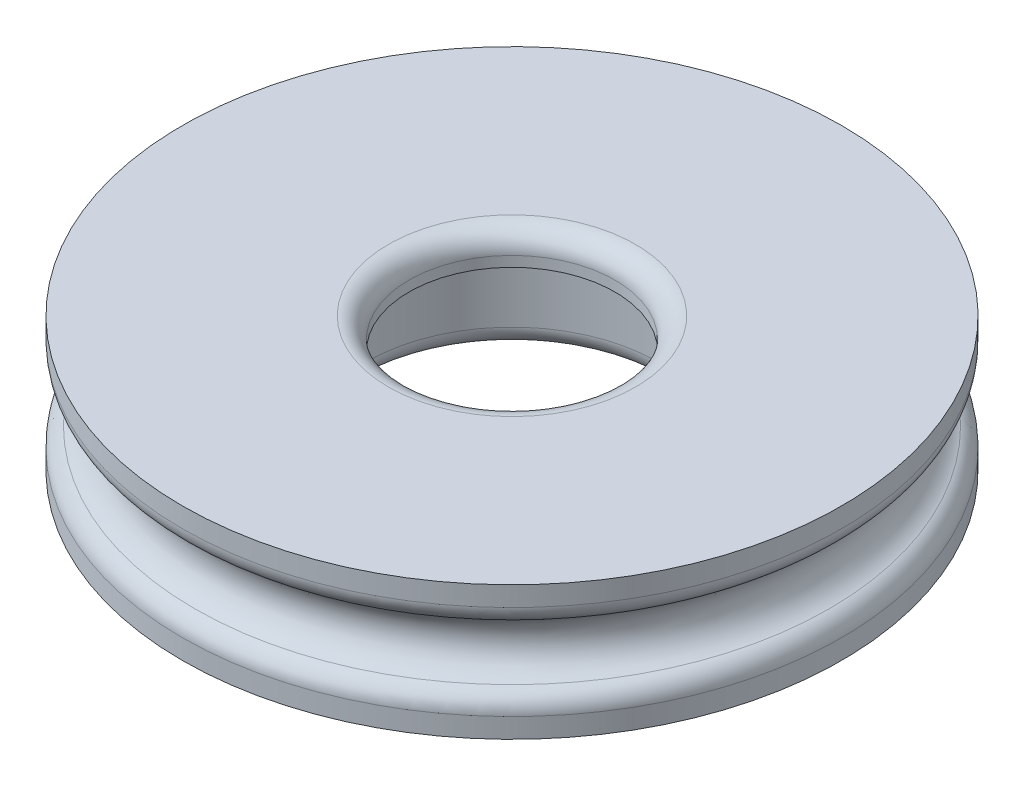
ISO-10303-21;
HEADER;
FILE_DESCRIPTION(('STEP AP214'),'2;1');
FILE_NAME('part.step','',(''),(''),'','','');
FILE_SCHEMA(('AUTOMOTIVE_DESIGN { 1 0 10303 214 1 1 1 1 }'));
ENDSEC;
DATA;
#1=APPLICATION_CONTEXT('core data for automotive mechanical design processes');
#2=APPLICATION_PROTOCOL_DEFINITION('international standard','automotive_design',2000,#1);
#3=PRODUCT_CONTEXT('',#1,'mechanical');
#4=PRODUCT('Part','Part','',(#3));
#5=PRODUCT_RELATED_PRODUCT_CATEGORY('part','',(#4));
#6=PRODUCT_DEFINITION_FORMATION('','',#4);
#7=PRODUCT_DEFINITION_CONTEXT('part definition',#1,'design');
#8=PRODUCT_DEFINITION('design','',#6,#7);
#9=PRODUCT_DEFINITION_SHAPE('','',#8);
#10=(LENGTH_UNIT() NAMED_UNIT(*) SI_UNIT(.MILLI.,.METRE.));
#11=(NAMED_UNIT(*) PLANE_ANGLE_UNIT() SI_UNIT($,.RADIAN.));
#12=(NAMED_UNIT(*) SI_UNIT($,.STERADIAN.) SOLID_ANGLE_UNIT());
#13=UNCERTAINTY_MEASURE_WITH_UNIT(LENGTH_MEASURE(1.E-05),#10,'distance_accuracy_value','');
#14=(GEOMETRIC_REPRESENTATION_CONTEXT(3) GLOBAL_UNCERTAINTY_ASSIGNED_CONTEXT((#13)) GLOBAL_UNIT_ASSIGNED_CONTEXT((#10,
#11,#12)) REPRESENTATION_CONTEXT('',''));
#15=CARTESIAN_POINT('',(0.,0.,0.));
#16=DIRECTION('',(0.,0.,1.));
#17=DIRECTION('',(1.,0.,0.));
#18=AXIS2_PLACEMENT_3D('',#15,#16,#17);
#19=CARTESIAN_POINT('',(0.,1.625,0.));
#20=DIRECTION('',(0.,-1.,0.));
#21=DIRECTION('',(0.,0.,-1.));
#22=AXIS2_PLACEMENT_3D('',#19,#20,#21);
#23=CYLINDRICAL_SURFACE('',#22,3.55);
#24=CARTESIAN_POINT('',(0.,0.375,0.));
#25=DIRECTION('',(0.,1.,0.));
#26=DIRECTION('',(0.,0.,1.));
#27=AXIS2_PLACEMENT_3D('',#24,#25,#26);
#28=CIRCLE('',#27,3.55);
#29=CARTESIAN_POINT('',(0.,0.375,-3.55));
#30=VERTEX_POINT('',#29);
#31=EDGE_CURVE('E65',#30,#30,#28,.T.);
#32=CARTESIAN_POINT('',(0.,-1.125,0.));
#33=DIRECTION('',(0.,1.,0.));
#34=DIRECTION('',(0.,0.,1.));
#35=AXIS2_PLACEMENT_3D('',#32,#33,#34);
#36=CIRCLE('',#35,3.55);
#37=CARTESIAN_POINT('',(0.,-1.125,-3.55));
#38=VERTEX_POINT('',#37);
#39=EDGE_CURVE('E68',#38,#38,#36,.F.);
#40=CARTESIAN_POINT('',(0.,0.375,-3.55));
#41=CARTESIAN_POINT('',(0.,0.359375,-3.55));
#42=CARTESIAN_POINT('',(0.,0.34375,-3.55));
#43=CARTESIAN_POINT('',(0.,0.3125,-3.55));
#44=CARTESIAN_POINT('',(0.,0.296875,-3.55));
#45=CARTESIAN_POINT('',(0.,0.265625,-3.55));
#46=CARTESIAN_POINT('',(0.,0.25,-3.55));
#47=CARTESIAN_POINT('',(0.,0.21875,-3.55));
#48=CARTESIAN_POINT('',(0.,0.203125,-3.55));
#49=CARTESIAN_POINT('',(0.,0.171875,-3.55));
#50=CARTESIAN_POINT('',(0.,0.15625,-3.55));
#51=CARTESIAN_POINT('',(0.,0.125,-3.55));
#52=CARTESIAN_POINT('',(0.,0.109375,-3.55));
#53=CARTESIAN_POINT('',(0.,0.0781249999999998,-3.55));
#54=CARTESIAN_POINT('',(0.,0.0624999999999998,-3.55));
#55=CARTESIAN_POINT('',(0.,0.0312499999999998,-3.55));
#56=CARTESIAN_POINT('',(0.,0.0156249999999998,-3.55));
#57=CARTESIAN_POINT('',(0.,-0.0156250000000002,-3.55));
#58=CARTESIAN_POINT('',(0.,-0.0312500000000002,-3.55));
#59=CARTESIAN_POINT('',(0.,-0.0625000000000003,-3.55));
#60=CARTESIAN_POINT('',(0.,-0.0781250000000003,-3.55));
#61=CARTESIAN_POINT('',(0.,-0.109375,-3.55));
#62=CARTESIAN_POINT('',(0.,-0.125,-3.55));
#63=CARTESIAN_POINT('',(0.,-0.15625,-3.55));
#64=CARTESIAN_POINT('',(0.,-0.171875,-3.55));
#65=CARTESIAN_POINT('',(0.,-0.203125,-3.55));
#66=CARTESIAN_POINT('',(0.,-0.21875,-3.55));
#67=CARTESIAN_POINT('',(0.,-0.25,-3.55));
#68=CARTESIAN_POINT('',(0.,-0.265625,-3.55));
#69=CARTESIAN_POINT('',(0.,-0.296875,-3.55));
#70=CARTESIAN_POINT('',(0.,-0.3125,-3.55));
#71=CARTESIAN_POINT('',(0.,-0.34375,-3.55));
#72=CARTESIAN_POINT('',(0.,-0.359375,-3.55));
#73=CARTESIAN_POINT('',(0.,-0.390625,-3.55));
#74=CARTESIAN_POINT('',(0.,-0.40625,-3.55));
#75=CARTESIAN_POINT('',(0.,-0.4375,-3.55));
#76=CARTESIAN_POINT('',(0.,-0.453125,-3.55));
#77=CARTESIAN_POINT('',(0.,-0.484375,-3.55));
#78=CARTESIAN_POINT('',(0.,-0.5,-3.55));
#79=CARTESIAN_POINT('',(0.,-0.53125,-3.55));
#80=CARTESIAN_POINT('',(0.,-0.546875,-3.55));
#81=CARTESIAN_POINT('',(0.,-0.578125,-3.55));
#82=CARTESIAN_POINT('',(0.,-0.59375,-3.55));
#83=CARTESIAN_POINT('',(0.,-0.625,-3.55));
#84=CARTESIAN_POINT('',(0.,-0.640625,-3.55));
#85=CARTESIAN_POINT('',(0.,-0.671875,-3.55));
#86=CARTESIAN_POINT('',(0.,-0.6875,-3.55));
#87=CARTESIAN_POINT('',(0.,-0.71875,-3.55));
#88=CARTESIAN_POINT('',(0.,-0.734375,-3.55));
#89=CARTESIAN_POINT('',(0.,-0.765625,-3.55));
#90=CARTESIAN_POINT('',(0.,-0.78125,-3.55));
#91=CARTESIAN_POINT('',(0.,-0.8125,-3.55));
#92=CARTESIAN_POINT('',(0.,-0.828125,-3.55));
#93=CARTESIAN_POINT('',(0.,-0.859375,-3.55));
#94=CARTESIAN_POINT('',(0.,-0.875,-3.55));
#95=CARTESIAN_POINT('',(0.,-0.90625,-3.55));
#96=CARTESIAN_POINT('',(0.,-0.921875,-3.55));
#97=CARTESIAN_POINT('',(0.,-0.953125,-3.55));
#98=CARTESIAN_POINT('',(0.,-0.96875,-3.55));
#99=CARTESIAN_POINT('',(0.,-1.,-3.55));
#100=CARTESIAN_POINT('',(0.,-1.015625,-3.55));
#101=CARTESIAN_POINT('',(0.,-1.046875,-3.55));
#102=CARTESIAN_POINT('',(0.,-1.0625,-3.55));
#103=CARTESIAN_POINT('',(0.,-1.09375,-3.55));
#104=CARTESIAN_POINT('',(0.,-1.109375,-3.55));
#105=CARTESIAN_POINT('',(0.,-1.125,-3.55));
#106=B_SPLINE_CURVE_WITH_KNOTS('',3,(#40,#41,#42,#43,#44,#45,#46,#47,#48,#49,#50,#51,#52,#53,
#54,#55,#56,#57,#58,#59,#60,#61,#62,#63,#64,#65,#66,#67,#68,#69,#70,#71,#72,#73,#74,#75,#76,#77,
#78,#79,#80,#81,#82,#83,#84,#85,#86,#87,#88,#89,#90,#91,#92,#93,#94,#95,#96,#97,#98,#99,#100,
#101,#102,#103,#104,#105),.UNSPECIFIED.,.F.,.F.,(4,2,2,2,2,2,2,2,2,2,2,2,2,2,2,2,2,2,2,2,2,2,2,
2,2,2,2,2,2,2,2,2,4),(0.,0.046875,0.0937500000000001,0.140625,0.1875,0.234375,0.28125,0.328125,
0.375,0.421875,0.46875,0.515625,0.5625,0.609375,0.65625,0.703125,0.75,0.796875,0.84375,0.890625,
0.9375,0.984375,1.03125,1.078125,1.125,1.171875,1.21875,1.265625,1.3125,1.359375,1.40625,
1.453125,1.5),.UNSPECIFIED.);
#107=EDGE_CURVE('BSEAM33',#30,#38,#106,.T.);
#108=ORIENTED_EDGE('',*,*,#31,.T.);
#109=ORIENTED_EDGE('',*,*,#39,.T.);
#110=ORIENTED_EDGE('',*,*,#107,.T.);
#111=ORIENTED_EDGE('',*,*,#107,.F.);
#112=EDGE_LOOP('',(#108,#110,#109,#111));
#113=FACE_BOUND('',#112,.T.);
#114=ADVANCED_FACE('F33',(#113),#23,.F.);
#115=CARTESIAN_POINT('',(0.,1.625,0.));
#116=DIRECTION('',(0.,-1.,0.));
#117=DIRECTION('',(0.,0.,-1.));
#118=AXIS2_PLACEMENT_3D('',#115,#116,#117);
#119=CYLINDRICAL_SURFACE('',#118,8.);
#120=CARTESIAN_POINT('',(0.,1.14564392373896,0.));
#121=DIRECTION('',(0.,-1.,0.));
#122=DIRECTION('',(0.,0.,-1.));
#123=AXIS2_PLACEMENT_3D('',#120,#121,#122);
#124=CIRCLE('',#123,8.);
#125=CARTESIAN_POINT('',(0.,1.14564392373896,-8.));
#126=VERTEX_POINT('',#125);
#127=EDGE_CURVE('E48',#126,#126,#124,.F.);
#128=CARTESIAN_POINT('',(0.,1.625,0.));
#129=DIRECTION('',(0.,1.,0.));
#130=DIRECTION('',(0.,0.,1.));
#131=AXIS2_PLACEMENT_3D('',#128,#129,#130);
#132=CIRCLE('',#131,8.);
#133=CARTESIAN_POINT('',(0.,1.625,-8.));
#134=VERTEX_POINT('',#133);
#135=EDGE_CURVE('E71',#134,#134,#132,.T.);
#136=CARTESIAN_POINT('',(0.,1.14564392373896,-8.));
#137=CARTESIAN_POINT('',(0.,1.15063721620001,-8.));
#138=CARTESIAN_POINT('',(0.,1.15563050866107,-8.));
#139=CARTESIAN_POINT('',(0.,1.16561709358317,-8.));
#140=CARTESIAN_POINT('',(0.,1.17061038604422,-8.));
#141=CARTESIAN_POINT('',(0.,1.18059697096633,-8.));
#142=CARTESIAN_POINT('',(0.,1.18559026342738,-8.));
#143=CARTESIAN_POINT('',(0.,1.19557684834949,-8.));
#144=CARTESIAN_POINT('',(0.,1.20057014081054,-8.));
#145=CARTESIAN_POINT('',(0.,1.21055672573264,-8.));
#146=CARTESIAN_POINT('',(0.,1.2155500181937,-8.));
#147=CARTESIAN_POINT('',(0.,1.2255366031158,-8.));
#148=CARTESIAN_POINT('',(0.,1.23052989557685,-8.));
#149=CARTESIAN_POINT('',(0.,1.24051648049896,-8.));
#150=CARTESIAN_POINT('',(0.,1.24550977296001,-8.));
#151=CARTESIAN_POINT('',(0.,1.25549635788212,-8.));
#152=CARTESIAN_POINT('',(0.,1.26048965034317,-8.));
#153=CARTESIAN_POINT('',(0.,1.27047623526527,-8.));
#154=CARTESIAN_POINT('',(0.,1.27546952772633,-8.));
#155=CARTESIAN_POINT('',(0.,1.28545611264843,-8.));
#156=CARTESIAN_POINT('',(0.,1.29044940510948,-8.));
#157=CARTESIAN_POINT('',(0.,1.30043599003159,-8.));
#158=CARTESIAN_POINT('',(0.,1.30542928249264,-8.));
#159=CARTESIAN_POINT('',(0.,1.31541586741475,-8.));
#160=CARTESIAN_POINT('',(0.,1.3204091598758,-8.));
#161=CARTESIAN_POINT('',(0.,1.3303957447979,-8.));
#162=CARTESIAN_POINT('',(0.,1.33538903725896,-8.));
#163=CARTESIAN_POINT('',(0.,1.34537562218106,-8.));
#164=CARTESIAN_POINT('',(0.,1.35036891464211,-8.));
#165=CARTESIAN_POINT('',(0.,1.36035549956422,-8.));
#166=CARTESIAN_POINT('',(0.,1.36534879202527,-8.));
#167=CARTESIAN_POINT('',(0.,1.37533537694738,-8.));
#168=CARTESIAN_POINT('',(0.,1.38032866940843,-8.));
#169=CARTESIAN_POINT('',(0.,1.39031525433053,-8.));
#170=CARTESIAN_POINT('',(0.,1.39530854679159,-8.));
#171=CARTESIAN_POINT('',(0.,1.40529513171369,-8.));
#172=CARTESIAN_POINT('',(0.,1.41028842417474,-8.));
#173=CARTESIAN_POINT('',(0.,1.42027500909685,-8.));
#174=CARTESIAN_POINT('',(0.,1.4252683015579,-8.));
#175=CARTESIAN_POINT('',(0.,1.43525488648001,-8.));
#176=CARTESIAN_POINT('',(0.,1.44024817894106,-8.));
#177=CARTESIAN_POINT('',(0.,1.45023476386316,-8.));
#178=CARTESIAN_POINT('',(0.,1.45522805632422,-8.));
#179=CARTESIAN_POINT('',(0.,1.46521464124632,-8.));
#180=CARTESIAN_POINT('',(0.,1.47020793370737,-8.));
#181=CARTESIAN_POINT('',(0.,1.48019451862948,-8.));
#182=CARTESIAN_POINT('',(0.,1.48518781109053,-8.));
#183=CARTESIAN_POINT('',(0.,1.49517439601264,-8.));
#184=CARTESIAN_POINT('',(0.,1.50016768847369,-8.));
#185=CARTESIAN_POINT('',(0.,1.51015427339579,-8.));
#186=CARTESIAN_POINT('',(0.,1.51514756585685,-8.));
#187=CARTESIAN_POINT('',(0.,1.52513415077895,-8.));
#188=CARTESIAN_POINT('',(0.,1.53012744324,-8.));
#189=CARTESIAN_POINT('',(0.,1.54011402816211,-8.));
#190=CARTESIAN_POINT('',(0.,1.54510732062316,-8.));
#191=CARTESIAN_POINT('',(0.,1.55509390554527,-8.));
#192=CARTESIAN_POINT('',(0.,1.56008719800632,-8.));
#193=CARTESIAN_POINT('',(0.,1.57007378292842,-8.));
#194=CARTESIAN_POINT('',(0.,1.57506707538947,-8.));
#195=CARTESIAN_POINT('',(0.,1.58505366031158,-8.));
#196=CARTESIAN_POINT('',(0.,1.59004695277263,-8.));
#197=CARTESIAN_POINT('',(0.,1.60003353769474,-8.));
#198=CARTESIAN_POINT('',(0.,1.60502683015579,-8.));
#199=CARTESIAN_POINT('',(0.,1.61501341507789,-8.));
#200=CARTESIAN_POINT('',(0.,1.62000670753895,-8.));
#201=CARTESIAN_POINT('',(0.,1.625,-8.));
#202=B_SPLINE_CURVE_WITH_KNOTS('',3,(#136,#137,#138,#139,#140,#141,#142,#143,#144,#145,#146,
#147,#148,#149,#150,#151,#152,#153,#154,#155,#156,#157,#158,#159,#160,#161,#162,#163,#164,#165,
#166,#167,#168,#169,#170,#171,#172,#173,#174,#175,#176,#177,#178,#179,#180,#181,#182,#183,#184,
#185,#186,#187,#188,#189,#190,#191,#192,#193,#194,#195,#196,#197,#198,#199,#200,#201),
.UNSPECIFIED.,.F.,.F.,(4,2,2,2,2,2,2,2,2,2,2,2,2,2,2,2,2,2,2,2,2,2,2,2,2,2,2,2,2,2,2,2,4),(0.,
0.0149798773831573,0.0299597547663147,0.0449396321494722,0.0599195095326297,0.0748993869157872,
0.0898792642989447,0.104859141682102,0.119839019065259,0.134818896448417,0.149798773831574,
0.164778651214732,0.179758528597889,0.194738405981047,0.209718283364204,0.224698160747362,
0.239678038130519,0.254657915513676,0.269637792896834,0.284617670279991,0.299597547663149,
0.314577425046306,0.329557302429464,0.344537179812621,0.359517057195778,0.374496934578936,
0.389476811962093,0.404456689345251,0.419436566728408,0.434416444111566,0.449396321494723,
0.464376198877881,0.479356076261038),.UNSPECIFIED.);
#203=EDGE_CURVE('BSEAM90',#126,#134,#202,.T.);
#204=ORIENTED_EDGE('',*,*,#127,.T.);
#205=ORIENTED_EDGE('',*,*,#135,.F.);
#206=ORIENTED_EDGE('',*,*,#203,.T.);
#207=ORIENTED_EDGE('',*,*,#203,.F.);
#208=EDGE_LOOP('',(#204,#206,#205,#207));
#209=FACE_BOUND('',#208,.T.);
#210=ADVANCED_FACE('F90',(#209),#119,.T.);
#211=CARTESIAN_POINT('',(0.,1.625,0.));
#212=DIRECTION('',(0.,1.,0.));
#213=DIRECTION('',(0.,0.,1.));
#214=AXIS2_PLACEMENT_3D('',#211,#212,#213);
#215=PLANE('',#214);
#216=CARTESIAN_POINT('',(0.,1.625,0.));
#217=DIRECTION('',(0.,1.,0.));
#218=DIRECTION('',(0.,0.,1.));
#219=AXIS2_PLACEMENT_3D('',#216,#217,#218);
#220=CIRCLE('',#219,3.);
#221=CARTESIAN_POINT('',(0.,1.625,3.));
#222=VERTEX_POINT('',#221);
#223=EDGE_CURVE('E53',#222,#222,#220,.F.);
#224=ORIENTED_EDGE('',*,*,#223,.T.);
#225=EDGE_LOOP('',(#224));
#226=FACE_BOUND('',#225,.T.);
#227=ORIENTED_EDGE('',*,*,#135,.T.);
#228=EDGE_LOOP('',(#227));
#229=FACE_BOUND('',#228,.T.);
#230=ADVANCED_FACE('F92',(#226,#229),#215,.T.);
#231=CARTESIAN_POINT('',(0.,-1.625,0.));
#232=DIRECTION('',(0.,1.,0.));
#233=DIRECTION('',(0.,0.,1.));
#234=AXIS2_PLACEMENT_3D('',#231,#232,#233);
#235=PLANE('',#234);
#236=CARTESIAN_POINT('',(0.,-1.625,0.));
#237=DIRECTION('',(0.,1.,0.));
#238=DIRECTION('',(0.,0.,1.));
#239=AXIS2_PLACEMENT_3D('',#236,#237,#238);
#240=CIRCLE('',#239,4.05);
#241=CARTESIAN_POINT('',(0.,-1.625,4.05));
#242=VERTEX_POINT('',#241);
#243=EDGE_CURVE('E59',#242,#242,#240,.T.);
#244=ORIENTED_EDGE('',*,*,#243,.T.);
#245=EDGE_LOOP('',(#244));
#246=FACE_BOUND('',#245,.T.);
#247=CARTESIAN_POINT('',(0.,-1.625,0.));
#248=DIRECTION('',(0.,1.,0.));
#249=DIRECTION('',(0.,0.,1.));
#250=AXIS2_PLACEMENT_3D('',#247,#248,#249);
#251=CIRCLE('',#250,8.);
#252=CARTESIAN_POINT('',(0.,-1.625,-8.));
#253=VERTEX_POINT('',#252);
#254=EDGE_CURVE('E72',#253,#253,#251,.T.);
#255=ORIENTED_EDGE('',*,*,#254,.F.);
#256=EDGE_LOOP('',(#255));
#257=FACE_BOUND('',#256,.T.);
#258=ADVANCED_FACE('F95',(#246,#257),#235,.F.);
#259=CARTESIAN_POINT('',(0.,-1.14564392373896,0.));
#260=DIRECTION('',(0.,-1.,0.));
#261=DIRECTION('',(0.,0.,-1.));
#262=AXIS2_PLACEMENT_3D('',#259,#260,#261);
#263=CIRCLE('',#262,8.);
#264=CARTESIAN_POINT('',(0.,-1.14564392373896,-8.));
#265=VERTEX_POINT('',#264);
#266=EDGE_CURVE('E10',#265,#265,#263,.T.);
#267=CARTESIAN_POINT('',(0.,-1.14564392373896,-8.));
#268=CARTESIAN_POINT('',(0.,-1.15063721620001,-8.));
#269=CARTESIAN_POINT('',(0.,-1.15563050866107,-8.));
#270=CARTESIAN_POINT('',(0.,-1.16561709358317,-8.));
#271=CARTESIAN_POINT('',(0.,-1.17061038604422,-8.));
#272=CARTESIAN_POINT('',(0.,-1.18059697096633,-8.));
#273=CARTESIAN_POINT('',(0.,-1.18559026342738,-8.));
#274=CARTESIAN_POINT('',(0.,-1.19557684834949,-8.));
#275=CARTESIAN_POINT('',(0.,-1.20057014081054,-8.));
#276=CARTESIAN_POINT('',(0.,-1.21055672573264,-8.));
#277=CARTESIAN_POINT('',(0.,-1.2155500181937,-8.));
#278=CARTESIAN_POINT('',(0.,-1.2255366031158,-8.));
#279=CARTESIAN_POINT('',(0.,-1.23052989557685,-8.));
#280=CARTESIAN_POINT('',(0.,-1.24051648049896,-8.));
#281=CARTESIAN_POINT('',(0.,-1.24550977296001,-8.));
#282=CARTESIAN_POINT('',(0.,-1.25549635788212,-8.));
#283=CARTESIAN_POINT('',(0.,-1.26048965034317,-8.));
#284=CARTESIAN_POINT('',(0.,-1.27047623526527,-8.));
#285=CARTESIAN_POINT('',(0.,-1.27546952772633,-8.));
#286=CARTESIAN_POINT('',(0.,-1.28545611264843,-8.));
#287=CARTESIAN_POINT('',(0.,-1.29044940510948,-8.));
#288=CARTESIAN_POINT('',(0.,-1.30043599003159,-8.));
#289=CARTESIAN_POINT('',(0.,-1.30542928249264,-8.));
#290=CARTESIAN_POINT('',(0.,-1.31541586741475,-8.));
#291=CARTESIAN_POINT('',(0.,-1.3204091598758,-8.));
#292=CARTESIAN_POINT('',(0.,-1.3303957447979,-8.));
#293=CARTESIAN_POINT('',(0.,-1.33538903725896,-8.));
#294=CARTESIAN_POINT('',(0.,-1.34537562218106,-8.));
#295=CARTESIAN_POINT('',(0.,-1.35036891464211,-8.));
#296=CARTESIAN_POINT('',(0.,-1.36035549956422,-8.));
#297=CARTESIAN_POINT('',(0.,-1.36534879202527,-8.));
#298=CARTESIAN_POINT('',(0.,-1.37533537694738,-8.));
#299=CARTESIAN_POINT('',(0.,-1.38032866940843,-8.));
#300=CARTESIAN_POINT('',(0.,-1.39031525433053,-8.));
#301=CARTESIAN_POINT('',(0.,-1.39530854679159,-8.));
#302=CARTESIAN_POINT('',(0.,-1.40529513171369,-8.));
#303=CARTESIAN_POINT('',(0.,-1.41028842417474,-8.));
#304=CARTESIAN_POINT('',(0.,-1.42027500909685,-8.));
#305=CARTESIAN_POINT('',(0.,-1.4252683015579,-8.));
#306=CARTESIAN_POINT('',(0.,-1.43525488648001,-8.));
#307=CARTESIAN_POINT('',(0.,-1.44024817894106,-8.));
#308=CARTESIAN_POINT('',(0.,-1.45023476386316,-8.));
#309=CARTESIAN_POINT('',(0.,-1.45522805632422,-8.));
#310=CARTESIAN_POINT('',(0.,-1.46521464124632,-8.));
#311=CARTESIAN_POINT('',(0.,-1.47020793370737,-8.));
#312=CARTESIAN_POINT('',(0.,-1.48019451862948,-8.));
#313=CARTESIAN_POINT('',(0.,-1.48518781109053,-8.));
#314=CARTESIAN_POINT('',(0.,-1.49517439601264,-8.));
#315=CARTESIAN_POINT('',(0.,-1.50016768847369,-8.));
#316=CARTESIAN_POINT('',(0.,-1.51015427339579,-8.));
#317=CARTESIAN_POINT('',(0.,-1.51514756585684,-8.));
#318=CARTESIAN_POINT('',(0.,-1.52513415077895,-8.));
#319=CARTESIAN_POINT('',(0.,-1.53012744324,-8.));
#320=CARTESIAN_POINT('',(0.,-1.54011402816211,-8.));
#321=CARTESIAN_POINT('',(0.,-1.54510732062316,-8.));
#322=CARTESIAN_POINT('',(0.,-1.55509390554527,-8.));
#323=CARTESIAN_POINT('',(0.,-1.56008719800632,-8.));
#324=CARTESIAN_POINT('',(0.,-1.57007378292842,-8.));
#325=CARTESIAN_POINT('',(0.,-1.57506707538947,-8.));
#326=CARTESIAN_POINT('',(0.,-1.58505366031158,-8.));
#327=CARTESIAN_POINT('',(0.,-1.59004695277263,-8.));
#328=CARTESIAN_POINT('',(0.,-1.60003353769474,-8.));
#329=CARTESIAN_POINT('',(0.,-1.60502683015579,-8.));
#330=CARTESIAN_POINT('',(0.,-1.61501341507789,-8.));
#331=CARTESIAN_POINT('',(0.,-1.62000670753895,-8.));
#332=CARTESIAN_POINT('',(0.,-1.625,-8.));
#333=B_SPLINE_CURVE_WITH_KNOTS('',3,(#267,#268,#269,#270,#271,#272,#273,#274,#275,#276,#277,
#278,#279,#280,#281,#282,#283,#284,#285,#286,#287,#288,#289,#290,#291,#292,#293,#294,#295,#296,
#297,#298,#299,#300,#301,#302,#303,#304,#305,#306,#307,#308,#309,#310,#311,#312,#313,#314,#315,
#316,#317,#318,#319,#320,#321,#322,#323,#324,#325,#326,#327,#328,#329,#330,#331,#332),
.UNSPECIFIED.,.F.,.F.,(4,2,2,2,2,2,2,2,2,2,2,2,2,2,2,2,2,2,2,2,2,2,2,2,2,2,2,2,2,2,2,2,4),(0.,
0.0149798773831575,0.029959754766315,0.0449396321494724,0.0599195095326299,0.0748993869157874,
0.0898792642989449,0.104859141682102,0.11983901906526,0.134818896448417,0.149798773831574,
0.164778651214732,0.179758528597889,0.194738405981047,0.209718283364204,0.224698160747362,
0.239678038130519,0.254657915513677,0.269637792896834,0.284617670279992,0.299597547663149,
0.314577425046307,0.329557302429464,0.344537179812621,0.359517057195779,0.374496934578936,
0.389476811962094,0.404456689345251,0.419436566728409,0.434416444111566,0.449396321494724,
0.464376198877881,0.479356076261038),.UNSPECIFIED.);
#334=EDGE_CURVE('BSEAM86',#265,#253,#333,.T.);
#335=ORIENTED_EDGE('',*,*,#266,.T.);
#336=ORIENTED_EDGE('',*,*,#254,.T.);
#337=ORIENTED_EDGE('',*,*,#334,.T.);
#338=ORIENTED_EDGE('',*,*,#334,.F.);
#339=EDGE_LOOP('',(#335,#337,#336,#338));
#340=FACE_BOUND('',#339,.T.);
#341=ADVANCED_FACE('F86',(#340),#119,.T.);
#342=CARTESIAN_POINT('',(0.,0.,8.));
#343=DIRECTION('',(1.,0.,0.));
#344=DIRECTION('',(0.,0.,-1.));
#345=AXIS2_PLACEMENT_3D('',#342,#343,#344);
#346=ELLIPSE('',#345,0.750000000000001,0.75);
#347=CARTESIAN_POINT('',(0.,1.625,0.));
#348=DIRECTION('',(0.,1.,0.));
#349=AXIS1_PLACEMENT('',#347,#348);
#350=SURFACE_OF_REVOLUTION('',#346,#349);
#351=CARTESIAN_POINT('',(0.,0.687386354243377,0.));
#352=DIRECTION('',(0.,1.,0.));
#353=DIRECTION('',(0.,0.,1.));
#354=AXIS2_PLACEMENT_3D('',#351,#352,#353);
#355=CIRCLE('',#354,7.7);
#356=CARTESIAN_POINT('',(0.,0.687386354243377,7.7));
#357=VERTEX_POINT('',#356);
#358=EDGE_CURVE('E40',#357,#357,#355,.F.);
#359=ORIENTED_EDGE('',*,*,#358,.T.);
#360=EDGE_LOOP('',(#359));
#361=FACE_BOUND('',#360,.T.);
#362=CARTESIAN_POINT('',(0.,-0.687386354243376,0.));
#363=DIRECTION('',(0.,1.,0.));
#364=DIRECTION('',(0.,0.,1.));
#365=AXIS2_PLACEMENT_3D('',#362,#363,#364);
#366=CIRCLE('',#365,7.7);
#367=CARTESIAN_POINT('',(0.,-0.687386354243376,7.7));
#368=VERTEX_POINT('',#367);
#369=EDGE_CURVE('E44',#368,#368,#366,.T.);
#370=ORIENTED_EDGE('',*,*,#369,.T.);
#371=EDGE_LOOP('',(#370));
#372=FACE_BOUND('',#371,.T.);
#373=ADVANCED_FACE('F81',(#361,#372),#350,.T.);
#374=CARTESIAN_POINT('',(0.,0.875,0.));
#375=DIRECTION('',(0.,1.,0.));
#376=DIRECTION('',(0.,0.,1.));
#377=AXIS2_PLACEMENT_3D('',#374,#375,#376);
#378=PLANE('',#377);
#379=CARTESIAN_POINT('',(0.,0.875,0.));
#380=DIRECTION('',(0.,1.,0.));
#381=DIRECTION('',(0.,0.,1.));
#382=AXIS2_PLACEMENT_3D('',#379,#380,#381);
#383=CIRCLE('',#382,3.05);
#384=CARTESIAN_POINT('',(0.,0.875,3.05));
#385=VERTEX_POINT('',#384);
#386=EDGE_CURVE('E62',#385,#385,#383,.F.);
#387=ORIENTED_EDGE('',*,*,#386,.T.);
#388=EDGE_LOOP('',(#387));
#389=FACE_BOUND('',#388,.T.);
#390=CARTESIAN_POINT('',(0.,0.875,0.));
#391=DIRECTION('',(0.,1.,0.));
#392=DIRECTION('',(0.,0.,1.));
#393=AXIS2_PLACEMENT_3D('',#390,#391,#392);
#394=CIRCLE('',#393,2.5);
#395=CARTESIAN_POINT('',(0.,0.875,2.5));
#396=VERTEX_POINT('',#395);
#397=EDGE_CURVE('E75',#396,#396,#394,.T.);
#398=ORIENTED_EDGE('',*,*,#397,.T.);
#399=EDGE_LOOP('',(#398));
#400=FACE_BOUND('',#399,.T.);
#401=ADVANCED_FACE('F85',(#389,#400),#378,.F.);
#402=CARTESIAN_POINT('',(0.,0.875,0.));
#403=DIRECTION('',(0.,1.,0.));
#404=DIRECTION('',(0.,0.,1.));
#405=AXIS2_PLACEMENT_3D('',#402,#403,#404);
#406=CYLINDRICAL_SURFACE('',#405,2.5);
#407=CARTESIAN_POINT('',(0.,1.125,0.));
#408=DIRECTION('',(0.,1.,0.));
#409=DIRECTION('',(0.,0.,1.));
#410=AXIS2_PLACEMENT_3D('',#407,#408,#409);
#411=CIRCLE('',#410,2.5);
#412=CARTESIAN_POINT('',(0.,1.125,2.5));
#413=VERTEX_POINT('',#412);
#414=EDGE_CURVE('E56',#413,#413,#411,.T.);
#415=ORIENTED_EDGE('',*,*,#414,.T.);
#416=EDGE_LOOP('',(#415));
#417=FACE_BOUND('',#416,.T.);
#418=ORIENTED_EDGE('',*,*,#397,.F.);
#419=EDGE_LOOP('',(#418));
#420=FACE_BOUND('',#419,.T.);
#421=ADVANCED_FACE('F106',(#417,#420),#406,.F.);
#422=CARTESIAN_POINT('',(0.,0.375,0.));
#423=DIRECTION('',(0.,1.,0.));
#424=DIRECTION('',(0.,0.,1.));
#425=AXIS2_PLACEMENT_3D('',#422,#423,#424);
#426=TOROIDAL_SURFACE('',#425,3.05,0.5);
#427=ORIENTED_EDGE('',*,*,#386,.F.);
#428=EDGE_LOOP('',(#427));
#429=FACE_BOUND('',#428,.T.);
#430=ORIENTED_EDGE('',*,*,#31,.F.);
#431=EDGE_LOOP('',(#430));
#432=FACE_BOUND('',#431,.T.);
#433=ADVANCED_FACE('F102',(#429,#432),#426,.F.);
#434=CARTESIAN_POINT('',(0.,-1.125,0.));
#435=DIRECTION('',(0.,1.,0.));
#436=DIRECTION('',(0.,0.,1.));
#437=AXIS2_PLACEMENT_3D('',#434,#435,#436);
#438=TOROIDAL_SURFACE('',#437,4.05,0.5);
#439=ORIENTED_EDGE('',*,*,#39,.F.);
#440=EDGE_LOOP('',(#439));
#441=FACE_BOUND('',#440,.T.);
#442=ORIENTED_EDGE('',*,*,#243,.F.);
#443=EDGE_LOOP('',(#442));
#444=FACE_BOUND('',#443,.T.);
#445=ADVANCED_FACE('F105',(#441,#444),#438,.T.);
#446=CARTESIAN_POINT('',(0.,1.125,0.));
#447=DIRECTION('',(0.,1.,0.));
#448=DIRECTION('',(0.,0.,1.));
#449=AXIS2_PLACEMENT_3D('',#446,#447,#448);
#450=TOROIDAL_SURFACE('',#449,3.,0.5);
#451=ORIENTED_EDGE('',*,*,#223,.F.);
#452=EDGE_LOOP('',(#451));
#453=FACE_BOUND('',#452,.T.);
#454=ORIENTED_EDGE('',*,*,#414,.F.);
#455=EDGE_LOOP('',(#454));
#456=FACE_BOUND('',#455,.T.);
#457=ADVANCED_FACE('F110',(#453,#456),#450,.T.);
#458=CARTESIAN_POINT('',(0.,1.14564392373896,0.));
#459=DIRECTION('',(0.,-1.,0.));
#460=DIRECTION('',(0.,0.,-1.));
#461=AXIS2_PLACEMENT_3D('',#458,#459,#460);
#462=TOROIDAL_SURFACE('',#461,7.5,0.5);
#463=ORIENTED_EDGE('',*,*,#358,.F.);
#464=EDGE_LOOP('',(#463));
#465=FACE_BOUND('',#464,.T.);
#466=ORIENTED_EDGE('',*,*,#127,.F.);
#467=EDGE_LOOP('',(#466));
#468=FACE_BOUND('',#467,.T.);
#469=ADVANCED_FACE('F113',(#465,#468),#462,.T.);
#470=CARTESIAN_POINT('',(0.,-1.14564392373896,0.));
#471=DIRECTION('',(0.,-1.,0.));
#472=DIRECTION('',(0.,0.,-1.));
#473=AXIS2_PLACEMENT_3D('',#470,#471,#472);
#474=TOROIDAL_SURFACE('',#473,7.5,0.5);
#475=ORIENTED_EDGE('',*,*,#266,.F.);
#476=EDGE_LOOP('',(#475));
#477=FACE_BOUND('',#476,.T.);
#478=ORIENTED_EDGE('',*,*,#369,.F.);
#479=EDGE_LOOP('',(#478));
#480=FACE_BOUND('',#479,.T.);
#481=ADVANCED_FACE('F35',(#477,#480),#474,.T.);
#482=CLOSED_SHELL('',(#114,#210,#230,#258,#341,#373,#401,#421,#433,#445,#457,#469,#481));
#483=MANIFOLD_SOLID_BREP('B2',#482);
#484=ADVANCED_BREP_SHAPE_REPRESENTATION('',(#18,#483),#14);
#485=SHAPE_DEFINITION_REPRESENTATION(#9,#484);
ENDSEC;
END-ISO-10303-21;
